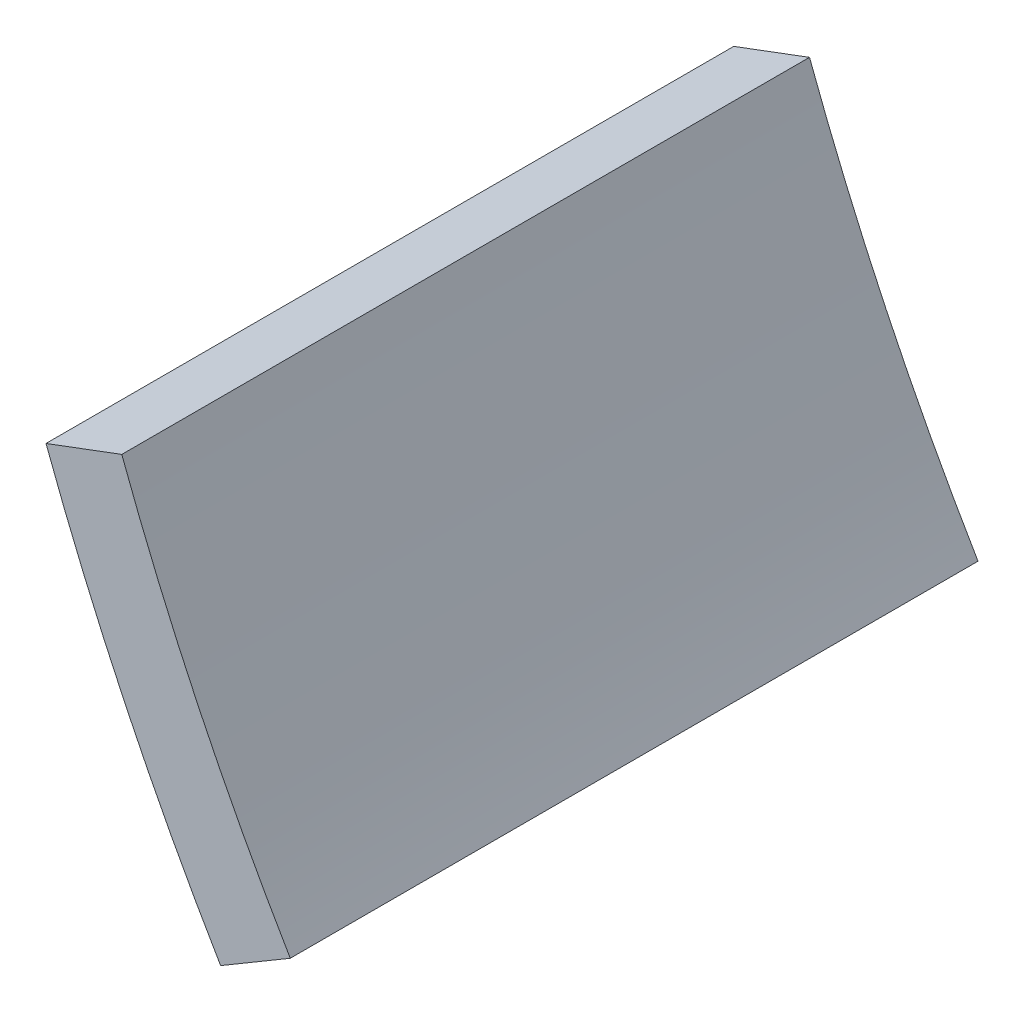
ISO-10303-21;
HEADER;
FILE_DESCRIPTION(('STEP AP214'),'2;1');
FILE_NAME('part.step','',(''),(''),'','','');
FILE_SCHEMA(('AUTOMOTIVE_DESIGN { 1 0 10303 214 1 1 1 1 }'));
ENDSEC;
DATA;
#1=APPLICATION_CONTEXT('core data for automotive mechanical design processes');
#2=APPLICATION_PROTOCOL_DEFINITION('international standard','automotive_design',2000,#1);
#3=PRODUCT_CONTEXT('',#1,'mechanical');
#4=PRODUCT('Part','Part','',(#3));
#5=PRODUCT_RELATED_PRODUCT_CATEGORY('part','',(#4));
#6=PRODUCT_DEFINITION_FORMATION('','',#4);
#7=PRODUCT_DEFINITION_CONTEXT('part definition',#1,'design');
#8=PRODUCT_DEFINITION('design','',#6,#7);
#9=PRODUCT_DEFINITION_SHAPE('','',#8);
#10=(LENGTH_UNIT() NAMED_UNIT(*) SI_UNIT(.MILLI.,.METRE.));
#11=(NAMED_UNIT(*) PLANE_ANGLE_UNIT() SI_UNIT($,.RADIAN.));
#12=(NAMED_UNIT(*) SI_UNIT($,.STERADIAN.) SOLID_ANGLE_UNIT());
#13=UNCERTAINTY_MEASURE_WITH_UNIT(LENGTH_MEASURE(1.E-05),#10,'distance_accuracy_value','');
#14=(GEOMETRIC_REPRESENTATION_CONTEXT(3) GLOBAL_UNCERTAINTY_ASSIGNED_CONTEXT((#13)) GLOBAL_UNIT_ASSIGNED_CONTEXT((#10,
#11,#12)) REPRESENTATION_CONTEXT('',''));
#15=CARTESIAN_POINT('',(0.,0.,0.));
#16=DIRECTION('',(0.,0.,1.));
#17=DIRECTION('',(1.,0.,0.));
#18=AXIS2_PLACEMENT_3D('',#15,#16,#17);
#19=CARTESIAN_POINT('',(0.,0.,17.));
#20=DIRECTION('',(0.,0.,-1.));
#21=DIRECTION('',(-1.,0.,0.));
#22=AXIS2_PLACEMENT_3D('',#19,#20,#21);
#23=CYLINDRICAL_SURFACE('',#22,55.);
#24=CARTESIAN_POINT('',(0.,0.,0.));
#25=DIRECTION('',(0.,0.,-1.));
#26=DIRECTION('',(-1.,0.,0.));
#27=AXIS2_PLACEMENT_3D('',#24,#25,#26);
#28=CIRCLE('',#27,55.);
#29=CARTESIAN_POINT('',(-47.3392015141785,-28.,0.));
#30=VERTEX_POINT('',#29);
#31=CARTESIAN_POINT('',(-51.5040269493459,-19.2959894278851,0.));
#32=VERTEX_POINT('',#31);
#33=EDGE_CURVE('E111',#30,#32,#28,.T.);
#34=ORIENTED_EDGE('',*,*,#33,.T.);
#35=DIRECTION('',(0.,0.,-1.));
#36=VECTOR('',#35,1.);
#37=CARTESIAN_POINT('',(-51.5040269493459,-19.2959894278851,17.));
#38=LINE('',#37,#36);
#39=CARTESIAN_POINT('',(-51.5040269493459,-19.2959894278851,17.));
#40=VERTEX_POINT('',#39);
#41=EDGE_CURVE('E11',#40,#32,#38,.T.);
#42=ORIENTED_EDGE('',*,*,#41,.F.);
#43=CARTESIAN_POINT('',(0.,0.,17.));
#44=DIRECTION('',(0.,0.,-1.));
#45=DIRECTION('',(-1.,0.,0.));
#46=AXIS2_PLACEMENT_3D('',#43,#44,#45);
#47=CIRCLE('',#46,55.);
#48=CARTESIAN_POINT('',(-47.3392015141785,-28.,17.));
#49=VERTEX_POINT('',#48);
#50=EDGE_CURVE('E95',#49,#40,#47,.T.);
#51=ORIENTED_EDGE('',*,*,#50,.F.);
#52=DIRECTION('',(0.,0.,-1.));
#53=VECTOR('',#52,1.);
#54=CARTESIAN_POINT('',(-47.3392015141785,-28.,17.));
#55=LINE('',#54,#53);
#56=EDGE_CURVE('E107',#49,#30,#55,.T.);
#57=ORIENTED_EDGE('',*,*,#56,.T.);
#58=EDGE_LOOP('',(#34,#42,#51,#57));
#59=FACE_BOUND('',#58,.T.);
#60=ADVANCED_FACE('F43',(#59),#23,.F.);
#61=CARTESIAN_POINT('',(-51.5040269493459,-19.2959894278851,17.));
#62=DIRECTION('',(0.350836171416093,-0.936436853624471,0.));
#63=DIRECTION('',(0.936436853624471,0.350836171416093,0.));
#64=AXIS2_PLACEMENT_3D('',#61,#62,#63);
#65=PLANE('',#64);
#66=DIRECTION('',(-0.93643685362447,-0.350836171416093,0.));
#67=VECTOR('',#66,1.);
#68=CARTESIAN_POINT('',(-51.5040269493459,-19.2959894278851,0.));
#69=LINE('',#68,#67);
#70=CARTESIAN_POINT('',(-53.3769006565948,-19.9976617707173,0.));
#71=VERTEX_POINT('',#70);
#72=EDGE_CURVE('E100',#32,#71,#69,.T.);
#73=ORIENTED_EDGE('',*,*,#72,.T.);
#74=DIRECTION('',(0.,0.,-1.));
#75=VECTOR('',#74,1.);
#76=CARTESIAN_POINT('',(-53.3769006565948,-19.9976617707173,17.));
#77=LINE('',#76,#75);
#78=CARTESIAN_POINT('',(-53.3769006565948,-19.9976617707173,17.));
#79=VERTEX_POINT('',#78);
#80=EDGE_CURVE('E52',#79,#71,#77,.T.);
#81=ORIENTED_EDGE('',*,*,#80,.F.);
#82=DIRECTION('',(-0.93643685362447,-0.350836171416093,0.));
#83=VECTOR('',#82,1.);
#84=CARTESIAN_POINT('',(-51.5040269493459,-19.2959894278851,17.));
#85=LINE('',#84,#83);
#86=EDGE_CURVE('E90',#40,#79,#85,.T.);
#87=ORIENTED_EDGE('',*,*,#86,.F.);
#88=ORIENTED_EDGE('',*,*,#41,.T.);
#89=EDGE_LOOP('',(#73,#81,#87,#88));
#90=FACE_BOUND('',#89,.T.);
#91=ADVANCED_FACE('F99',(#90),#65,.F.);
#92=CARTESIAN_POINT('',(0.,0.,17.));
#93=DIRECTION('',(0.,0.,-1.));
#94=DIRECTION('',(-1.,0.,0.));
#95=AXIS2_PLACEMENT_3D('',#92,#93,#94);
#96=CYLINDRICAL_SURFACE('',#95,57.);
#97=CARTESIAN_POINT('',(0.,0.,0.));
#98=DIRECTION('',(0.,0.,1.));
#99=DIRECTION('',(-1.,0.,0.));
#100=AXIS2_PLACEMENT_3D('',#97,#98,#99);
#101=CIRCLE('',#100,57.);
#102=CARTESIAN_POINT('',(-49.060627023785,-29.0181818181818,0.));
#103=VERTEX_POINT('',#102);
#104=EDGE_CURVE('E77',#71,#103,#101,.T.);
#105=ORIENTED_EDGE('',*,*,#104,.T.);
#106=DIRECTION('',(0.,0.,-1.));
#107=VECTOR('',#106,1.);
#108=CARTESIAN_POINT('',(-49.060627023785,-29.0181818181818,17.));
#109=LINE('',#108,#107);
#110=CARTESIAN_POINT('',(-49.060627023785,-29.0181818181818,17.));
#111=VERTEX_POINT('',#110);
#112=EDGE_CURVE('E102',#111,#103,#109,.T.);
#113=ORIENTED_EDGE('',*,*,#112,.F.);
#114=CARTESIAN_POINT('',(0.,0.,17.));
#115=DIRECTION('',(0.,0.,1.));
#116=DIRECTION('',(-1.,0.,0.));
#117=AXIS2_PLACEMENT_3D('',#114,#115,#116);
#118=CIRCLE('',#117,57.);
#119=EDGE_CURVE('E93',#79,#111,#118,.T.);
#120=ORIENTED_EDGE('',*,*,#119,.F.);
#121=ORIENTED_EDGE('',*,*,#80,.T.);
#122=EDGE_LOOP('',(#105,#113,#120,#121));
#123=FACE_BOUND('',#122,.T.);
#124=ADVANCED_FACE('F103',(#123),#96,.T.);
#125=CARTESIAN_POINT('',(-47.3392015141785,-28.,17.));
#126=DIRECTION('',(-0.50909090909091,0.860712754803245,0.));
#127=DIRECTION('',(-0.860712754803245,-0.50909090909091,0.));
#128=AXIS2_PLACEMENT_3D('',#125,#126,#127);
#129=PLANE('',#128);
#130=DIRECTION('',(0.860712754803245,0.50909090909091,0.));
#131=VECTOR('',#130,1.);
#132=CARTESIAN_POINT('',(-47.3392015141785,-28.,0.));
#133=LINE('',#132,#131);
#134=EDGE_CURVE('E83',#103,#30,#133,.T.);
#135=ORIENTED_EDGE('',*,*,#134,.T.);
#136=ORIENTED_EDGE('',*,*,#56,.F.);
#137=DIRECTION('',(0.860712754803245,0.50909090909091,0.));
#138=VECTOR('',#137,1.);
#139=CARTESIAN_POINT('',(-47.3392015141785,-28.,17.));
#140=LINE('',#139,#138);
#141=EDGE_CURVE('E60',#111,#49,#140,.T.);
#142=ORIENTED_EDGE('',*,*,#141,.F.);
#143=ORIENTED_EDGE('',*,*,#112,.T.);
#144=EDGE_LOOP('',(#135,#136,#142,#143));
#145=FACE_BOUND('',#144,.T.);
#146=ADVANCED_FACE('F124',(#145),#129,.F.);
#147=CARTESIAN_POINT('',(0.,0.,17.));
#148=DIRECTION('',(0.,0.,-1.));
#149=DIRECTION('',(-1.,0.,0.));
#150=AXIS2_PLACEMENT_3D('',#147,#148,#149);
#151=PLANE('',#150);
#152=ORIENTED_EDGE('',*,*,#50,.T.);
#153=ORIENTED_EDGE('',*,*,#86,.T.);
#154=ORIENTED_EDGE('',*,*,#119,.T.);
#155=ORIENTED_EDGE('',*,*,#141,.T.);
#156=EDGE_LOOP('',(#152,#153,#154,#155));
#157=FACE_BOUND('',#156,.T.);
#158=ADVANCED_FACE('F91',(#157),#151,.F.);
#159=CARTESIAN_POINT('',(0.,0.,0.));
#160=DIRECTION('',(0.,0.,-1.));
#161=DIRECTION('',(-1.,0.,0.));
#162=AXIS2_PLACEMENT_3D('',#159,#160,#161);
#163=PLANE('',#162);
#164=ORIENTED_EDGE('',*,*,#33,.F.);
#165=ORIENTED_EDGE('',*,*,#134,.F.);
#166=ORIENTED_EDGE('',*,*,#104,.F.);
#167=ORIENTED_EDGE('',*,*,#72,.F.);
#168=EDGE_LOOP('',(#164,#165,#166,#167));
#169=FACE_BOUND('',#168,.T.);
#170=ADVANCED_FACE('F127',(#169),#163,.T.);
#171=CLOSED_SHELL('',(#60,#91,#124,#146,#158,#170));
#172=MANIFOLD_SOLID_BREP('B2',#171);
#173=ADVANCED_BREP_SHAPE_REPRESENTATION('',(#18,#172),#14);
#174=SHAPE_DEFINITION_REPRESENTATION(#9,#173);
ENDSEC;
END-ISO-10303-21;
